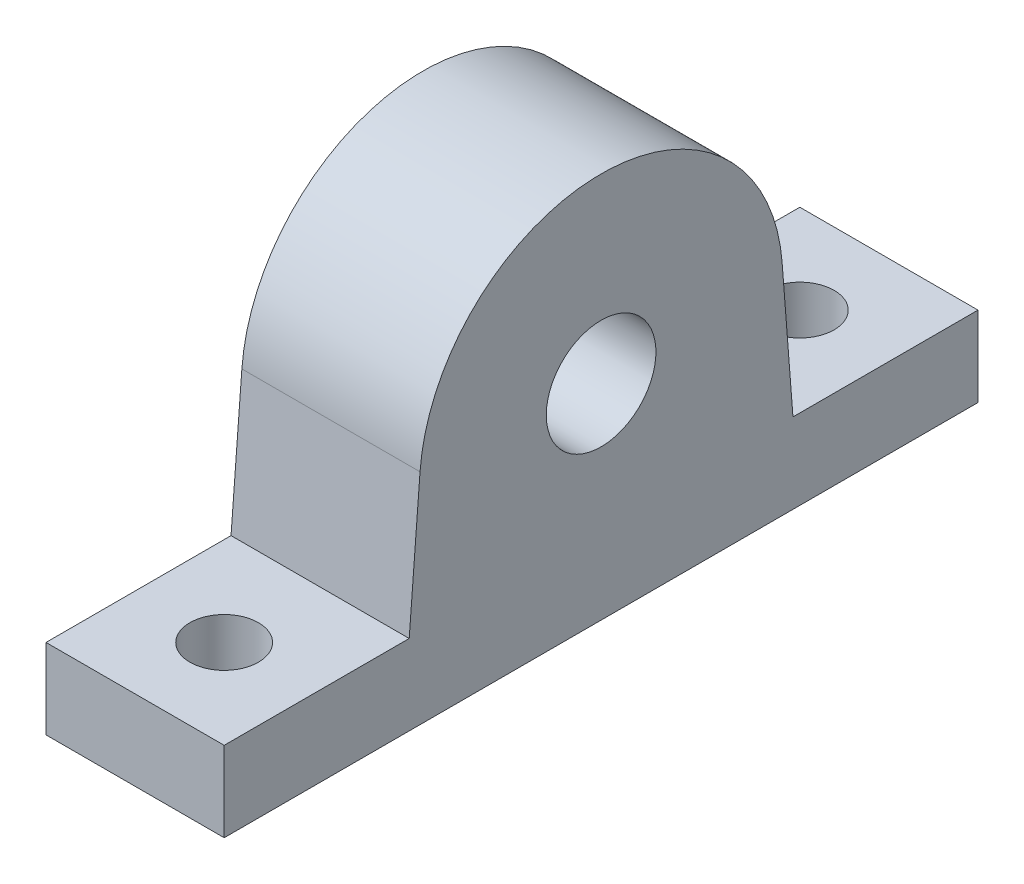
ISO-10303-21;
HEADER;
FILE_DESCRIPTION(('STEP AP214'),'2;1');
FILE_NAME('part.step','',(''),(''),'','','');
FILE_SCHEMA(('AUTOMOTIVE_DESIGN { 1 0 10303 214 1 1 1 1 }'));
ENDSEC;
DATA;
#1=APPLICATION_CONTEXT('core data for automotive mechanical design processes');
#2=APPLICATION_PROTOCOL_DEFINITION('international standard','automotive_design',2000,#1);
#3=PRODUCT_CONTEXT('',#1,'mechanical');
#4=PRODUCT('Part','Part','',(#3));
#5=PRODUCT_RELATED_PRODUCT_CATEGORY('part','',(#4));
#6=PRODUCT_DEFINITION_FORMATION('','',#4);
#7=PRODUCT_DEFINITION_CONTEXT('part definition',#1,'design');
#8=PRODUCT_DEFINITION('design','',#6,#7);
#9=PRODUCT_DEFINITION_SHAPE('','',#8);
#10=(LENGTH_UNIT() NAMED_UNIT(*) SI_UNIT(.MILLI.,.METRE.));
#11=(NAMED_UNIT(*) PLANE_ANGLE_UNIT() SI_UNIT($,.RADIAN.));
#12=(NAMED_UNIT(*) SI_UNIT($,.STERADIAN.) SOLID_ANGLE_UNIT());
#13=UNCERTAINTY_MEASURE_WITH_UNIT(LENGTH_MEASURE(1.E-05),#10,'distance_accuracy_value','');
#14=(GEOMETRIC_REPRESENTATION_CONTEXT(3) GLOBAL_UNCERTAINTY_ASSIGNED_CONTEXT((#13)) GLOBAL_UNIT_ASSIGNED_CONTEXT((#10,
#11,#12)) REPRESENTATION_CONTEXT('',''));
#15=CARTESIAN_POINT('',(0.,0.,0.));
#16=DIRECTION('',(0.,0.,1.));
#17=DIRECTION('',(1.,0.,0.));
#18=AXIS2_PLACEMENT_3D('',#15,#16,#17);
#19=CARTESIAN_POINT('',(13.,0.,0.));
#20=DIRECTION('',(1.,0.,0.));
#21=DIRECTION('',(0.,0.,-1.));
#22=AXIS2_PLACEMENT_3D('',#19,#20,#21);
#23=PLANE('',#22);
#24=DIRECTION('',(0.,-1.,0.));
#25=VECTOR('',#24,1.);
#26=CARTESIAN_POINT('',(13.,-14.95,27.5));
#27=LINE('',#26,#25);
#28=CARTESIAN_POINT('',(13.,-9.10776694635545,27.5));
#29=VERTEX_POINT('',#28);
#30=CARTESIAN_POINT('',(13.,-14.95,27.5));
#31=VERTEX_POINT('',#30);
#32=EDGE_CURVE('E148',#29,#31,#27,.T.);
#33=ORIENTED_EDGE('',*,*,#32,.T.);
#34=DIRECTION('',(0.,0.,-1.));
#35=VECTOR('',#34,1.);
#36=CARTESIAN_POINT('',(13.,-14.95,-27.5));
#37=LINE('',#36,#35);
#38=CARTESIAN_POINT('',(13.,-14.95,-27.5));
#39=VERTEX_POINT('',#38);
#40=EDGE_CURVE('E96',#31,#39,#37,.T.);
#41=ORIENTED_EDGE('',*,*,#40,.T.);
#42=DIRECTION('',(0.,1.,0.));
#43=VECTOR('',#42,1.);
#44=CARTESIAN_POINT('',(13.,-14.95,-27.5));
#45=LINE('',#44,#43);
#46=CARTESIAN_POINT('',(13.,-9.10776694635543,-27.5));
#47=VERTEX_POINT('',#46);
#48=EDGE_CURVE('E180',#39,#47,#45,.T.);
#49=ORIENTED_EDGE('',*,*,#48,.T.);
#50=DIRECTION('',(0.,0.,1.));
#51=VECTOR('',#50,1.);
#52=CARTESIAN_POINT('',(13.,-9.10776694635543,-27.5));
#53=LINE('',#52,#51);
#54=CARTESIAN_POINT('',(13.,-9.10776694635543,-14.));
#55=VERTEX_POINT('',#54);
#56=EDGE_CURVE('E182',#47,#55,#53,.T.);
#57=ORIENTED_EDGE('',*,*,#56,.T.);
#58=DIRECTION('',(0.,0.996976773627443,0.0777001470231267));
#59=VECTOR('',#58,1.);
#60=CARTESIAN_POINT('',(13.,-9.10776694635543,-14.));
#61=LINE('',#60,#59);
#62=CARTESIAN_POINT('',(13.,1.02952694805644,-13.2099422505636));
#63=VERTEX_POINT('',#62);
#64=EDGE_CURVE('E115',#55,#63,#61,.T.);
#65=ORIENTED_EDGE('',*,*,#64,.T.);
#66=CARTESIAN_POINT('',(13.,0.,0.));
#67=DIRECTION('',(1.,0.,0.));
#68=DIRECTION('',(0.,0.,-1.));
#69=AXIS2_PLACEMENT_3D('',#66,#67,#68);
#70=CIRCLE('',#69,13.25);
#71=CARTESIAN_POINT('',(13.,1.02952694805643,13.2099422505636));
#72=VERTEX_POINT('',#71);
#73=EDGE_CURVE('E109',#63,#72,#70,.T.);
#74=ORIENTED_EDGE('',*,*,#73,.T.);
#75=DIRECTION('',(0.,-0.996976773627443,0.0777001470231267));
#76=VECTOR('',#75,1.);
#77=CARTESIAN_POINT('',(13.,-9.10776694635545,14.));
#78=LINE('',#77,#76);
#79=CARTESIAN_POINT('',(13.,-9.10776694635545,14.));
#80=VERTEX_POINT('',#79);
#81=EDGE_CURVE('E113',#72,#80,#78,.T.);
#82=ORIENTED_EDGE('',*,*,#81,.T.);
#83=DIRECTION('',(0.,0.,1.));
#84=VECTOR('',#83,1.);
#85=CARTESIAN_POINT('',(13.,-9.10776694635545,27.5));
#86=LINE('',#85,#84);
#87=EDGE_CURVE('E53',#80,#29,#86,.T.);
#88=ORIENTED_EDGE('',*,*,#87,.T.);
#89=EDGE_LOOP('',(#33,#41,#49,#57,#65,#74,#82,#88));
#90=FACE_BOUND('',#89,.T.);
#91=CARTESIAN_POINT('',(13.,0.,0.));
#92=DIRECTION('',(1.,0.,0.));
#93=DIRECTION('',(0.,0.,-1.));
#94=AXIS2_PLACEMENT_3D('',#91,#92,#93);
#95=CIRCLE('',#94,4.);
#96=CARTESIAN_POINT('',(13.,0.,4.));
#97=VERTEX_POINT('',#96);
#98=EDGE_CURVE('E137',#97,#97,#95,.T.);
#99=ORIENTED_EDGE('',*,*,#98,.F.);
#100=EDGE_LOOP('',(#99));
#101=FACE_BOUND('',#100,.T.);
#102=ADVANCED_FACE('F34',(#90,#101),#23,.T.);
#103=CARTESIAN_POINT('',(0.,0.,0.));
#104=DIRECTION('',(1.,0.,0.));
#105=DIRECTION('',(0.,0.,-1.));
#106=AXIS2_PLACEMENT_3D('',#103,#104,#105);
#107=PLANE('',#106);
#108=DIRECTION('',(0.,-1.,0.));
#109=VECTOR('',#108,1.);
#110=CARTESIAN_POINT('',(0.,-14.95,27.5));
#111=LINE('',#110,#109);
#112=CARTESIAN_POINT('',(0.,-9.10776694635545,27.5));
#113=VERTEX_POINT('',#112);
#114=CARTESIAN_POINT('',(0.,-14.95,27.5));
#115=VERTEX_POINT('',#114);
#116=EDGE_CURVE('E133',#113,#115,#111,.T.);
#117=ORIENTED_EDGE('',*,*,#116,.F.);
#118=DIRECTION('',(0.,0.,1.));
#119=VECTOR('',#118,1.);
#120=CARTESIAN_POINT('',(0.,-9.10776694635545,27.5));
#121=LINE('',#120,#119);
#122=CARTESIAN_POINT('',(0.,-9.10776694635545,14.));
#123=VERTEX_POINT('',#122);
#124=EDGE_CURVE('E88',#123,#113,#121,.T.);
#125=ORIENTED_EDGE('',*,*,#124,.F.);
#126=DIRECTION('',(0.,-0.996976773627443,0.0777001470231267));
#127=VECTOR('',#126,1.);
#128=CARTESIAN_POINT('',(0.,-9.10776694635545,14.));
#129=LINE('',#128,#127);
#130=CARTESIAN_POINT('',(0.,1.02952694805643,13.2099422505636));
#131=VERTEX_POINT('',#130);
#132=EDGE_CURVE('E82',#131,#123,#129,.T.);
#133=ORIENTED_EDGE('',*,*,#132,.F.);
#134=CARTESIAN_POINT('',(0.,0.,0.));
#135=DIRECTION('',(1.,0.,0.));
#136=DIRECTION('',(0.,0.,-1.));
#137=AXIS2_PLACEMENT_3D('',#134,#135,#136);
#138=CIRCLE('',#137,13.25);
#139=CARTESIAN_POINT('',(0.,1.02952694805644,-13.2099422505636));
#140=VERTEX_POINT('',#139);
#141=EDGE_CURVE('E123',#140,#131,#138,.T.);
#142=ORIENTED_EDGE('',*,*,#141,.F.);
#143=DIRECTION('',(0.,0.996976773627443,0.0777001470231267));
#144=VECTOR('',#143,1.);
#145=CARTESIAN_POINT('',(0.,-9.10776694635543,-14.));
#146=LINE('',#145,#144);
#147=CARTESIAN_POINT('',(0.,-9.10776694635543,-14.));
#148=VERTEX_POINT('',#147);
#149=EDGE_CURVE('E143',#148,#140,#146,.T.);
#150=ORIENTED_EDGE('',*,*,#149,.F.);
#151=DIRECTION('',(0.,0.,1.));
#152=VECTOR('',#151,1.);
#153=CARTESIAN_POINT('',(0.,-9.10776694635543,-27.5));
#154=LINE('',#153,#152);
#155=CARTESIAN_POINT('',(0.,-9.10776694635543,-27.5));
#156=VERTEX_POINT('',#155);
#157=EDGE_CURVE('E141',#156,#148,#154,.T.);
#158=ORIENTED_EDGE('',*,*,#157,.F.);
#159=DIRECTION('',(0.,1.,0.));
#160=VECTOR('',#159,1.);
#161=CARTESIAN_POINT('',(0.,-14.95,-27.5));
#162=LINE('',#161,#160);
#163=CARTESIAN_POINT('',(0.,-14.95,-27.5));
#164=VERTEX_POINT('',#163);
#165=EDGE_CURVE('E139',#164,#156,#162,.T.);
#166=ORIENTED_EDGE('',*,*,#165,.F.);
#167=DIRECTION('',(0.,0.,-1.));
#168=VECTOR('',#167,1.);
#169=CARTESIAN_POINT('',(0.,-14.95,-27.5));
#170=LINE('',#169,#168);
#171=EDGE_CURVE('E136',#115,#164,#170,.T.);
#172=ORIENTED_EDGE('',*,*,#171,.F.);
#173=EDGE_LOOP('',(#117,#125,#133,#142,#150,#158,#166,#172));
#174=FACE_BOUND('',#173,.T.);
#175=CARTESIAN_POINT('',(0.,0.,0.));
#176=DIRECTION('',(1.,0.,0.));
#177=DIRECTION('',(0.,0.,-1.));
#178=AXIS2_PLACEMENT_3D('',#175,#176,#177);
#179=CIRCLE('',#178,4.);
#180=CARTESIAN_POINT('',(0.,0.,4.));
#181=VERTEX_POINT('',#180);
#182=EDGE_CURVE('E165',#181,#181,#179,.T.);
#183=ORIENTED_EDGE('',*,*,#182,.T.);
#184=EDGE_LOOP('',(#183));
#185=FACE_BOUND('',#184,.T.);
#186=ADVANCED_FACE('F195',(#174,#185),#107,.F.);
#187=CARTESIAN_POINT('',(13.,-14.95,27.5));
#188=DIRECTION('',(0.,0.,-1.));
#189=DIRECTION('',(-1.,0.,0.));
#190=AXIS2_PLACEMENT_3D('',#187,#188,#189);
#191=PLANE('',#190);
#192=ORIENTED_EDGE('',*,*,#116,.T.);
#193=DIRECTION('',(-1.,0.,0.));
#194=VECTOR('',#193,1.);
#195=CARTESIAN_POINT('',(13.,-14.95,27.5));
#196=LINE('',#195,#194);
#197=EDGE_CURVE('E11',#31,#115,#196,.T.);
#198=ORIENTED_EDGE('',*,*,#197,.F.);
#199=ORIENTED_EDGE('',*,*,#32,.F.);
#200=DIRECTION('',(-1.,0.,0.));
#201=VECTOR('',#200,1.);
#202=CARTESIAN_POINT('',(13.,-9.10776694635545,27.5));
#203=LINE('',#202,#201);
#204=EDGE_CURVE('E129',#29,#113,#203,.T.);
#205=ORIENTED_EDGE('',*,*,#204,.T.);
#206=EDGE_LOOP('',(#192,#198,#199,#205));
#207=FACE_BOUND('',#206,.T.);
#208=ADVANCED_FACE('F36',(#207),#191,.F.);
#209=CARTESIAN_POINT('',(13.,-14.95,-27.5));
#210=DIRECTION('',(0.,1.,0.));
#211=DIRECTION('',(0.,0.,1.));
#212=AXIS2_PLACEMENT_3D('',#209,#210,#211);
#213=PLANE('',#212);
#214=CARTESIAN_POINT('',(6.5,-14.95,-21.));
#215=DIRECTION('',(0.,1.,0.));
#216=DIRECTION('',(0.,0.,1.));
#217=AXIS2_PLACEMENT_3D('',#214,#215,#216);
#218=CIRCLE('',#217,2.5);
#219=CARTESIAN_POINT('',(6.5,-14.95,-18.5));
#220=VERTEX_POINT('',#219);
#221=EDGE_CURVE('E161',#220,#220,#218,.T.);
#222=ORIENTED_EDGE('',*,*,#221,.T.);
#223=EDGE_LOOP('',(#222));
#224=FACE_BOUND('',#223,.T.);
#225=CARTESIAN_POINT('',(6.5,-14.95,21.));
#226=DIRECTION('',(0.,1.,0.));
#227=DIRECTION('',(0.,0.,-1.));
#228=AXIS2_PLACEMENT_3D('',#225,#226,#227);
#229=CIRCLE('',#228,2.49999999999999);
#230=CARTESIAN_POINT('',(6.5,-14.95,18.5));
#231=VERTEX_POINT('',#230);
#232=EDGE_CURVE('E167',#231,#231,#229,.T.);
#233=ORIENTED_EDGE('',*,*,#232,.T.);
#234=EDGE_LOOP('',(#233));
#235=FACE_BOUND('',#234,.T.);
#236=ORIENTED_EDGE('',*,*,#171,.T.);
#237=DIRECTION('',(-1.,0.,0.));
#238=VECTOR('',#237,1.);
#239=CARTESIAN_POINT('',(13.,-14.95,-27.5));
#240=LINE('',#239,#238);
#241=EDGE_CURVE('E44',#39,#164,#240,.T.);
#242=ORIENTED_EDGE('',*,*,#241,.F.);
#243=ORIENTED_EDGE('',*,*,#40,.F.);
#244=ORIENTED_EDGE('',*,*,#197,.T.);
#245=EDGE_LOOP('',(#236,#242,#243,#244));
#246=FACE_BOUND('',#245,.T.);
#247=ADVANCED_FACE('F239',(#224,#235,#246),#213,.F.);
#248=CARTESIAN_POINT('',(13.,-14.95,-27.5));
#249=DIRECTION('',(0.,0.,1.));
#250=DIRECTION('',(1.,0.,0.));
#251=AXIS2_PLACEMENT_3D('',#248,#249,#250);
#252=PLANE('',#251);
#253=ORIENTED_EDGE('',*,*,#165,.T.);
#254=DIRECTION('',(-1.,0.,0.));
#255=VECTOR('',#254,1.);
#256=CARTESIAN_POINT('',(13.,-9.10776694635543,-27.5));
#257=LINE('',#256,#255);
#258=EDGE_CURVE('E155',#47,#156,#257,.T.);
#259=ORIENTED_EDGE('',*,*,#258,.F.);
#260=ORIENTED_EDGE('',*,*,#48,.F.);
#261=ORIENTED_EDGE('',*,*,#241,.T.);
#262=EDGE_LOOP('',(#253,#259,#260,#261));
#263=FACE_BOUND('',#262,.T.);
#264=ADVANCED_FACE('F232',(#263),#252,.F.);
#265=CARTESIAN_POINT('',(13.,-9.10776694635543,-27.5));
#266=DIRECTION('',(0.,-1.,0.));
#267=DIRECTION('',(0.,0.,-1.));
#268=AXIS2_PLACEMENT_3D('',#265,#266,#267);
#269=PLANE('',#268);
#270=CARTESIAN_POINT('',(6.5,-9.10776694635543,-21.));
#271=DIRECTION('',(0.,-1.,0.));
#272=DIRECTION('',(0.,0.,-1.));
#273=AXIS2_PLACEMENT_3D('',#270,#271,#272);
#274=CIRCLE('',#273,2.5);
#275=CARTESIAN_POINT('',(6.5,-9.10776694635543,-23.5));
#276=VERTEX_POINT('',#275);
#277=EDGE_CURVE('E38',#276,#276,#274,.T.);
#278=ORIENTED_EDGE('',*,*,#277,.T.);
#279=EDGE_LOOP('',(#278));
#280=FACE_BOUND('',#279,.T.);
#281=ORIENTED_EDGE('',*,*,#157,.T.);
#282=DIRECTION('',(-1.,0.,0.));
#283=VECTOR('',#282,1.);
#284=CARTESIAN_POINT('',(13.,-9.10776694635543,-14.));
#285=LINE('',#284,#283);
#286=EDGE_CURVE('E152',#55,#148,#285,.T.);
#287=ORIENTED_EDGE('',*,*,#286,.F.);
#288=ORIENTED_EDGE('',*,*,#56,.F.);
#289=ORIENTED_EDGE('',*,*,#258,.T.);
#290=EDGE_LOOP('',(#281,#287,#288,#289));
#291=FACE_BOUND('',#290,.T.);
#292=ADVANCED_FACE('F188',(#280,#291),#269,.F.);
#293=CARTESIAN_POINT('',(13.,-9.10776694635543,-14.));
#294=DIRECTION('',(0.,-0.0777001470231267,0.996976773627443));
#295=DIRECTION('',(0.,-0.996976773627443,-0.0777001470231267));
#296=AXIS2_PLACEMENT_3D('',#293,#294,#295);
#297=PLANE('',#296);
#298=ORIENTED_EDGE('',*,*,#149,.T.);
#299=DIRECTION('',(-1.,0.,0.));
#300=VECTOR('',#299,1.);
#301=CARTESIAN_POINT('',(13.,1.02952694805644,-13.2099422505636));
#302=LINE('',#301,#300);
#303=EDGE_CURVE('E124',#63,#140,#302,.T.);
#304=ORIENTED_EDGE('',*,*,#303,.F.);
#305=ORIENTED_EDGE('',*,*,#64,.F.);
#306=ORIENTED_EDGE('',*,*,#286,.T.);
#307=EDGE_LOOP('',(#298,#304,#305,#306));
#308=FACE_BOUND('',#307,.T.);
#309=ADVANCED_FACE('F192',(#308),#297,.F.);
#310=CARTESIAN_POINT('',(13.,0.,0.));
#311=DIRECTION('',(-1.,0.,0.));
#312=DIRECTION('',(0.,0.,1.));
#313=AXIS2_PLACEMENT_3D('',#310,#311,#312);
#314=CYLINDRICAL_SURFACE('',#313,13.25);
#315=ORIENTED_EDGE('',*,*,#141,.T.);
#316=DIRECTION('',(-1.,0.,0.));
#317=VECTOR('',#316,1.);
#318=CARTESIAN_POINT('',(13.,1.02952694805643,13.2099422505636));
#319=LINE('',#318,#317);
#320=EDGE_CURVE('E120',#72,#131,#319,.T.);
#321=ORIENTED_EDGE('',*,*,#320,.F.);
#322=ORIENTED_EDGE('',*,*,#73,.F.);
#323=ORIENTED_EDGE('',*,*,#303,.T.);
#324=EDGE_LOOP('',(#315,#321,#322,#323));
#325=FACE_BOUND('',#324,.T.);
#326=ADVANCED_FACE('F121',(#325),#314,.T.);
#327=CARTESIAN_POINT('',(13.,-9.10776694635545,14.));
#328=DIRECTION('',(0.,-0.0777001470231267,-0.996976773627443));
#329=DIRECTION('',(0.,0.996976773627443,-0.0777001470231267));
#330=AXIS2_PLACEMENT_3D('',#327,#328,#329);
#331=PLANE('',#330);
#332=ORIENTED_EDGE('',*,*,#132,.T.);
#333=DIRECTION('',(-1.,0.,0.));
#334=VECTOR('',#333,1.);
#335=CARTESIAN_POINT('',(13.,-9.10776694635545,14.));
#336=LINE('',#335,#334);
#337=EDGE_CURVE('E125',#80,#123,#336,.T.);
#338=ORIENTED_EDGE('',*,*,#337,.F.);
#339=ORIENTED_EDGE('',*,*,#81,.F.);
#340=ORIENTED_EDGE('',*,*,#320,.T.);
#341=EDGE_LOOP('',(#332,#338,#339,#340));
#342=FACE_BOUND('',#341,.T.);
#343=ADVANCED_FACE('F127',(#342),#331,.F.);
#344=CARTESIAN_POINT('',(13.,-9.10776694635545,27.5));
#345=DIRECTION('',(0.,-1.,0.));
#346=DIRECTION('',(0.,0.,-1.));
#347=AXIS2_PLACEMENT_3D('',#344,#345,#346);
#348=PLANE('',#347);
#349=CARTESIAN_POINT('',(6.5,-9.10776694635545,21.));
#350=DIRECTION('',(0.,-1.,0.));
#351=DIRECTION('',(0.,0.,-1.));
#352=AXIS2_PLACEMENT_3D('',#349,#350,#351);
#353=CIRCLE('',#352,2.49999999999999);
#354=CARTESIAN_POINT('',(6.5,-9.10776694635545,18.5));
#355=VERTEX_POINT('',#354);
#356=EDGE_CURVE('E159',#355,#355,#353,.T.);
#357=ORIENTED_EDGE('',*,*,#356,.T.);
#358=EDGE_LOOP('',(#357));
#359=FACE_BOUND('',#358,.T.);
#360=ORIENTED_EDGE('',*,*,#124,.T.);
#361=ORIENTED_EDGE('',*,*,#204,.F.);
#362=ORIENTED_EDGE('',*,*,#87,.F.);
#363=ORIENTED_EDGE('',*,*,#337,.T.);
#364=EDGE_LOOP('',(#360,#361,#362,#363));
#365=FACE_BOUND('',#364,.T.);
#366=ADVANCED_FACE('F201',(#359,#365),#348,.F.);
#367=CARTESIAN_POINT('',(13.,0.,0.));
#368=DIRECTION('',(-1.,0.,0.));
#369=DIRECTION('',(0.,0.,1.));
#370=AXIS2_PLACEMENT_3D('',#367,#368,#369);
#371=CYLINDRICAL_SURFACE('',#370,4.);
#372=CARTESIAN_POINT('',(13.,0.,4.));
#373=CARTESIAN_POINT('',(12.8645833333333,0.,4.));
#374=CARTESIAN_POINT('',(12.7291666666667,0.,4.));
#375=CARTESIAN_POINT('',(12.4583333333333,0.,4.));
#376=CARTESIAN_POINT('',(12.3229166666667,0.,4.));
#377=CARTESIAN_POINT('',(12.0520833333333,0.,4.));
#378=CARTESIAN_POINT('',(11.9166666666667,0.,4.));
#379=CARTESIAN_POINT('',(11.6458333333333,0.,4.));
#380=CARTESIAN_POINT('',(11.5104166666667,0.,4.));
#381=CARTESIAN_POINT('',(11.2395833333333,0.,4.));
#382=CARTESIAN_POINT('',(11.1041666666667,0.,4.));
#383=CARTESIAN_POINT('',(10.8333333333333,0.,4.));
#384=CARTESIAN_POINT('',(10.6979166666667,0.,4.));
#385=CARTESIAN_POINT('',(10.4270833333333,0.,4.));
#386=CARTESIAN_POINT('',(10.2916666666667,0.,4.));
#387=CARTESIAN_POINT('',(10.0208333333333,0.,4.));
#388=CARTESIAN_POINT('',(9.88541666666667,0.,4.));
#389=CARTESIAN_POINT('',(9.61458333333333,0.,4.));
#390=CARTESIAN_POINT('',(9.47916666666667,0.,4.));
#391=CARTESIAN_POINT('',(9.20833333333333,0.,4.));
#392=CARTESIAN_POINT('',(9.07291666666667,0.,4.));
#393=CARTESIAN_POINT('',(8.80208333333333,0.,4.));
#394=CARTESIAN_POINT('',(8.66666666666667,0.,4.));
#395=CARTESIAN_POINT('',(8.39583333333333,0.,4.));
#396=CARTESIAN_POINT('',(8.26041666666667,0.,4.));
#397=CARTESIAN_POINT('',(7.98958333333333,0.,4.));
#398=CARTESIAN_POINT('',(7.85416666666667,0.,4.));
#399=CARTESIAN_POINT('',(7.58333333333333,0.,4.));
#400=CARTESIAN_POINT('',(7.44791666666667,0.,4.));
#401=CARTESIAN_POINT('',(7.17708333333333,0.,4.));
#402=CARTESIAN_POINT('',(7.04166666666667,0.,4.));
#403=CARTESIAN_POINT('',(6.77083333333333,0.,4.));
#404=CARTESIAN_POINT('',(6.63541666666667,0.,4.));
#405=CARTESIAN_POINT('',(6.36458333333333,0.,4.));
#406=CARTESIAN_POINT('',(6.22916666666667,0.,4.));
#407=CARTESIAN_POINT('',(5.95833333333333,0.,4.));
#408=CARTESIAN_POINT('',(5.82291666666667,0.,4.));
#409=CARTESIAN_POINT('',(5.55208333333333,0.,4.));
#410=CARTESIAN_POINT('',(5.41666666666667,0.,4.));
#411=CARTESIAN_POINT('',(5.14583333333333,0.,4.));
#412=CARTESIAN_POINT('',(5.01041666666667,0.,4.));
#413=CARTESIAN_POINT('',(4.73958333333333,0.,4.));
#414=CARTESIAN_POINT('',(4.60416666666667,0.,4.));
#415=CARTESIAN_POINT('',(4.33333333333333,0.,4.));
#416=CARTESIAN_POINT('',(4.19791666666667,0.,4.));
#417=CARTESIAN_POINT('',(3.92708333333333,0.,4.));
#418=CARTESIAN_POINT('',(3.79166666666667,0.,4.));
#419=CARTESIAN_POINT('',(3.52083333333333,0.,4.));
#420=CARTESIAN_POINT('',(3.38541666666667,0.,4.));
#421=CARTESIAN_POINT('',(3.11458333333333,0.,4.));
#422=CARTESIAN_POINT('',(2.97916666666667,0.,4.));
#423=CARTESIAN_POINT('',(2.70833333333333,0.,4.));
#424=CARTESIAN_POINT('',(2.57291666666667,0.,4.));
#425=CARTESIAN_POINT('',(2.30208333333333,0.,4.));
#426=CARTESIAN_POINT('',(2.16666666666667,0.,4.));
#427=CARTESIAN_POINT('',(1.89583333333333,0.,4.));
#428=CARTESIAN_POINT('',(1.76041666666667,0.,4.));
#429=CARTESIAN_POINT('',(1.48958333333333,0.,4.));
#430=CARTESIAN_POINT('',(1.35416666666667,0.,4.));
#431=CARTESIAN_POINT('',(1.08333333333333,0.,4.));
#432=CARTESIAN_POINT('',(0.947916666666667,0.,4.));
#433=CARTESIAN_POINT('',(0.677083333333334,0.,4.));
#434=CARTESIAN_POINT('',(0.541666666666667,0.,4.));
#435=CARTESIAN_POINT('',(0.270833333333334,0.,4.));
#436=CARTESIAN_POINT('',(0.135416666666667,0.,4.));
#437=CARTESIAN_POINT('',(0.,0.,4.));
#438=B_SPLINE_CURVE_WITH_KNOTS('',3,(#372,#373,#374,#375,#376,#377,#378,#379,#380,#381,#382,
#383,#384,#385,#386,#387,#388,#389,#390,#391,#392,#393,#394,#395,#396,#397,#398,#399,#400,#401,
#402,#403,#404,#405,#406,#407,#408,#409,#410,#411,#412,#413,#414,#415,#416,#417,#418,#419,#420,
#421,#422,#423,#424,#425,#426,#427,#428,#429,#430,#431,#432,#433,#434,#435,#436,#437),
.UNSPECIFIED.,.F.,.F.,(4,2,2,2,2,2,2,2,2,2,2,2,2,2,2,2,2,2,2,2,2,2,2,2,2,2,2,2,2,2,2,2,4),(0.,
0.406249999999999,0.812499999999999,1.21875,1.625,2.03125,2.4375,2.84375,3.25,3.65625,4.0625,
4.46875,4.875,5.28125,5.6875,6.09375,6.5,6.90625,7.3125,7.71875,8.125,8.53125,8.9375,9.34375,
9.75,10.15625,10.5625,10.96875,11.375,11.78125,12.1875,12.59375,13.),.UNSPECIFIED.);
#439=EDGE_CURVE('BSEAM203',#97,#181,#438,.T.);
#440=ORIENTED_EDGE('',*,*,#98,.T.);
#441=ORIENTED_EDGE('',*,*,#182,.F.);
#442=ORIENTED_EDGE('',*,*,#439,.T.);
#443=ORIENTED_EDGE('',*,*,#439,.F.);
#444=EDGE_LOOP('',(#440,#442,#441,#443));
#445=FACE_BOUND('',#444,.T.);
#446=ADVANCED_FACE('F203',(#445),#371,.F.);
#447=CARTESIAN_POINT('',(6.5,-14.95,21.));
#448=DIRECTION('',(0.,1.,0.));
#449=DIRECTION('',(0.,0.,1.));
#450=AXIS2_PLACEMENT_3D('',#447,#448,#449);
#451=CYLINDRICAL_SURFACE('',#450,2.49999999999999);
#452=ORIENTED_EDGE('',*,*,#232,.F.);
#453=EDGE_LOOP('',(#452));
#454=FACE_BOUND('',#453,.T.);
#455=ORIENTED_EDGE('',*,*,#356,.F.);
#456=EDGE_LOOP('',(#455));
#457=FACE_BOUND('',#456,.T.);
#458=ADVANCED_FACE('F209',(#454,#457),#451,.F.);
#459=CARTESIAN_POINT('',(6.5,-14.95,-21.));
#460=DIRECTION('',(0.,1.,0.));
#461=DIRECTION('',(0.,0.,1.));
#462=AXIS2_PLACEMENT_3D('',#459,#460,#461);
#463=CYLINDRICAL_SURFACE('',#462,2.5);
#464=ORIENTED_EDGE('',*,*,#221,.F.);
#465=EDGE_LOOP('',(#464));
#466=FACE_BOUND('',#465,.T.);
#467=ORIENTED_EDGE('',*,*,#277,.F.);
#468=EDGE_LOOP('',(#467));
#469=FACE_BOUND('',#468,.T.);
#470=ADVANCED_FACE('F222',(#466,#469),#463,.F.);
#471=CLOSED_SHELL('',(#102,#186,#208,#247,#264,#292,#309,#326,#343,#366,#446,#458,#470));
#472=MANIFOLD_SOLID_BREP('B2',#471);
#473=ADVANCED_BREP_SHAPE_REPRESENTATION('',(#18,#472),#14);
#474=SHAPE_DEFINITION_REPRESENTATION(#9,#473);
ENDSEC;
END-ISO-10303-21;
